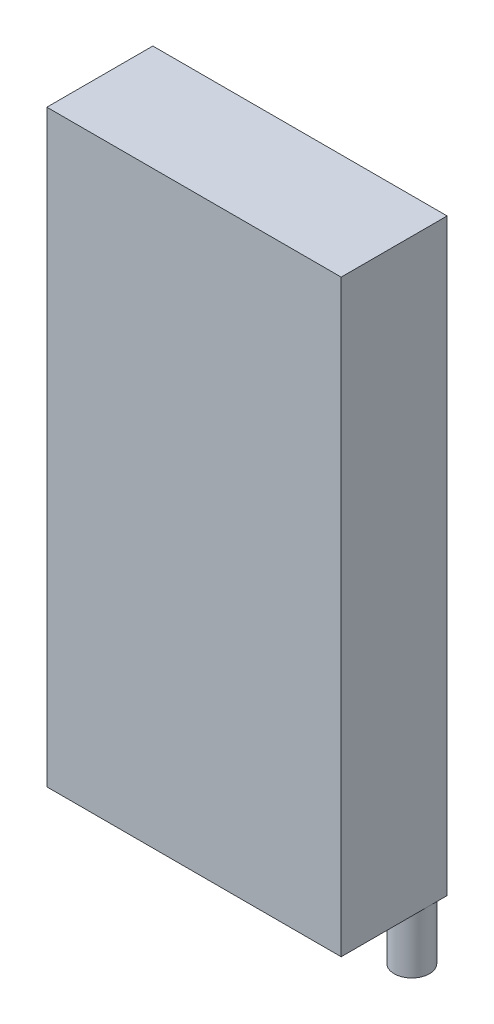
ISO-10303-21;
HEADER;
FILE_DESCRIPTION(('STEP AP214'),'2;1');
FILE_NAME('part.step','',(''),(''),'','','');
FILE_SCHEMA(('AUTOMOTIVE_DESIGN { 1 0 10303 214 1 1 1 1 }'));
ENDSEC;
DATA;
#1=APPLICATION_CONTEXT('core data for automotive mechanical design processes');
#2=APPLICATION_PROTOCOL_DEFINITION('international standard','automotive_design',2000,#1);
#3=PRODUCT_CONTEXT('',#1,'mechanical');
#4=PRODUCT('Part','Part','',(#3));
#5=PRODUCT_RELATED_PRODUCT_CATEGORY('part','',(#4));
#6=PRODUCT_DEFINITION_FORMATION('','',#4);
#7=PRODUCT_DEFINITION_CONTEXT('part definition',#1,'design');
#8=PRODUCT_DEFINITION('design','',#6,#7);
#9=PRODUCT_DEFINITION_SHAPE('','',#8);
#10=(LENGTH_UNIT() NAMED_UNIT(*) SI_UNIT(.MILLI.,.METRE.));
#11=(NAMED_UNIT(*) PLANE_ANGLE_UNIT() SI_UNIT($,.RADIAN.));
#12=(NAMED_UNIT(*) SI_UNIT($,.STERADIAN.) SOLID_ANGLE_UNIT());
#13=UNCERTAINTY_MEASURE_WITH_UNIT(LENGTH_MEASURE(1.E-05),#10,'distance_accuracy_value','');
#14=(GEOMETRIC_REPRESENTATION_CONTEXT(3) GLOBAL_UNCERTAINTY_ASSIGNED_CONTEXT((#13)) GLOBAL_UNIT_ASSIGNED_CONTEXT((#10,
#11,#12)) REPRESENTATION_CONTEXT('',''));
#15=CARTESIAN_POINT('',(0.,0.,0.));
#16=DIRECTION('',(0.,0.,1.));
#17=DIRECTION('',(1.,0.,0.));
#18=AXIS2_PLACEMENT_3D('',#15,#16,#17);
#19=CARTESIAN_POINT('',(-12.5,-25.,9.));
#20=DIRECTION('',(0.,1.,0.));
#21=DIRECTION('',(0.,0.,1.));
#22=AXIS2_PLACEMENT_3D('',#19,#20,#21);
#23=PLANE('',#22);
#24=CARTESIAN_POINT('',(-11.,-25.,1.5));
#25=DIRECTION('',(0.,-1.,0.));
#26=DIRECTION('',(0.,0.,-1.));
#27=AXIS2_PLACEMENT_3D('',#24,#25,#26);
#28=CIRCLE('',#27,1.5);
#29=CARTESIAN_POINT('',(-12.5,-25.,1.5));
#30=VERTEX_POINT('',#29);
#31=CARTESIAN_POINT('',(-11.,-25.,0.));
#32=VERTEX_POINT('',#31);
#33=EDGE_CURVE('E111',#30,#32,#28,.T.);
#34=ORIENTED_EDGE('',*,*,#33,.F.);
#35=DIRECTION('',(0.,0.,-1.));
#36=VECTOR('',#35,1.);
#37=CARTESIAN_POINT('',(-12.5,-25.,9.));
#38=LINE('',#37,#36);
#39=CARTESIAN_POINT('',(-12.5,-25.,0.));
#40=VERTEX_POINT('',#39);
#41=EDGE_CURVE('E98',#30,#40,#38,.T.);
#42=ORIENTED_EDGE('',*,*,#41,.T.);
#43=DIRECTION('',(1.,0.,0.));
#44=VECTOR('',#43,1.);
#45=CARTESIAN_POINT('',(-12.5,-25.,0.));
#46=LINE('',#45,#44);
#47=EDGE_CURVE('E112',#40,#32,#46,.T.);
#48=ORIENTED_EDGE('',*,*,#47,.T.);
#49=EDGE_LOOP('',(#34,#42,#48));
#50=FACE_BOUND('',#49,.T.);
#51=ADVANCED_FACE('F39',(#50),#23,.F.);
#52=CARTESIAN_POINT('',(11.,-25.,1.5));
#53=DIRECTION('',(0.,-1.,0.));
#54=DIRECTION('',(0.,0.,1.));
#55=AXIS2_PLACEMENT_3D('',#52,#53,#54);
#56=CIRCLE('',#55,1.5);
#57=CARTESIAN_POINT('',(11.,-25.,0.));
#58=VERTEX_POINT('',#57);
#59=CARTESIAN_POINT('',(12.5,-25.,1.5));
#60=VERTEX_POINT('',#59);
#61=EDGE_CURVE('E49',#58,#60,#56,.T.);
#62=ORIENTED_EDGE('',*,*,#61,.F.);
#63=CARTESIAN_POINT('',(12.5,-25.,0.));
#64=VERTEX_POINT('',#63);
#65=EDGE_CURVE('E139',#58,#64,#46,.T.);
#66=ORIENTED_EDGE('',*,*,#65,.T.);
#67=DIRECTION('',(0.,0.,-1.));
#68=VECTOR('',#67,1.);
#69=CARTESIAN_POINT('',(12.5,-25.,9.));
#70=LINE('',#69,#68);
#71=EDGE_CURVE('E133',#60,#64,#70,.T.);
#72=ORIENTED_EDGE('',*,*,#71,.F.);
#73=EDGE_LOOP('',(#62,#66,#72));
#74=FACE_BOUND('',#73,.T.);
#75=ADVANCED_FACE('F157',(#74),#23,.F.);
#76=CARTESIAN_POINT('',(12.5,25.,9.));
#77=DIRECTION('',(-1.,0.,0.));
#78=DIRECTION('',(0.,-1.,0.));
#79=AXIS2_PLACEMENT_3D('',#76,#77,#78);
#80=PLANE('',#79);
#81=DIRECTION('',(0.,1.,0.));
#82=VECTOR('',#81,1.);
#83=CARTESIAN_POINT('',(12.5,25.,0.));
#84=LINE('',#83,#82);
#85=CARTESIAN_POINT('',(12.5,25.,0.));
#86=VERTEX_POINT('',#85);
#87=EDGE_CURVE('E122',#64,#86,#84,.T.);
#88=ORIENTED_EDGE('',*,*,#87,.T.);
#89=DIRECTION('',(0.,0.,-1.));
#90=VECTOR('',#89,1.);
#91=CARTESIAN_POINT('',(12.5,25.,9.));
#92=LINE('',#91,#90);
#93=CARTESIAN_POINT('',(12.5,25.,9.));
#94=VERTEX_POINT('',#93);
#95=EDGE_CURVE('E43',#94,#86,#92,.T.);
#96=ORIENTED_EDGE('',*,*,#95,.F.);
#97=DIRECTION('',(0.,1.,0.));
#98=VECTOR('',#97,1.);
#99=CARTESIAN_POINT('',(12.5,25.,9.));
#100=LINE('',#99,#98);
#101=CARTESIAN_POINT('',(12.5,-25.,9.));
#102=VERTEX_POINT('',#101);
#103=EDGE_CURVE('E125',#102,#94,#100,.T.);
#104=ORIENTED_EDGE('',*,*,#103,.F.);
#105=EDGE_CURVE('E109',#102,#60,#70,.T.);
#106=ORIENTED_EDGE('',*,*,#105,.T.);
#107=ORIENTED_EDGE('',*,*,#71,.T.);
#108=EDGE_LOOP('',(#88,#96,#104,#106,#107));
#109=FACE_BOUND('',#108,.T.);
#110=ADVANCED_FACE('F41',(#109),#80,.F.);
#111=CARTESIAN_POINT('',(-12.5,25.,9.));
#112=DIRECTION('',(0.,-1.,0.));
#113=DIRECTION('',(0.,0.,-1.));
#114=AXIS2_PLACEMENT_3D('',#111,#112,#113);
#115=PLANE('',#114);
#116=DIRECTION('',(-1.,0.,0.));
#117=VECTOR('',#116,1.);
#118=CARTESIAN_POINT('',(-12.5,25.,0.));
#119=LINE('',#118,#117);
#120=CARTESIAN_POINT('',(-12.5,25.,0.));
#121=VERTEX_POINT('',#120);
#122=EDGE_CURVE('E136',#86,#121,#119,.T.);
#123=ORIENTED_EDGE('',*,*,#122,.T.);
#124=DIRECTION('',(0.,0.,-1.));
#125=VECTOR('',#124,1.);
#126=CARTESIAN_POINT('',(-12.5,25.,9.));
#127=LINE('',#126,#125);
#128=CARTESIAN_POINT('',(-12.5,25.,9.));
#129=VERTEX_POINT('',#128);
#130=EDGE_CURVE('E97',#129,#121,#127,.T.);
#131=ORIENTED_EDGE('',*,*,#130,.F.);
#132=DIRECTION('',(-1.,0.,0.));
#133=VECTOR('',#132,1.);
#134=CARTESIAN_POINT('',(-12.5,25.,9.));
#135=LINE('',#134,#133);
#136=EDGE_CURVE('E128',#94,#129,#135,.T.);
#137=ORIENTED_EDGE('',*,*,#136,.F.);
#138=ORIENTED_EDGE('',*,*,#95,.T.);
#139=EDGE_LOOP('',(#123,#131,#137,#138));
#140=FACE_BOUND('',#139,.T.);
#141=ADVANCED_FACE('F147',(#140),#115,.F.);
#142=CARTESIAN_POINT('',(-12.5,25.,9.));
#143=DIRECTION('',(1.,0.,0.));
#144=DIRECTION('',(0.,1.,0.));
#145=AXIS2_PLACEMENT_3D('',#142,#143,#144);
#146=PLANE('',#145);
#147=DIRECTION('',(0.,-1.,0.));
#148=VECTOR('',#147,1.);
#149=CARTESIAN_POINT('',(-12.5,25.,0.));
#150=LINE('',#149,#148);
#151=EDGE_CURVE('E105',#121,#40,#150,.T.);
#152=ORIENTED_EDGE('',*,*,#151,.T.);
#153=ORIENTED_EDGE('',*,*,#41,.F.);
#154=CARTESIAN_POINT('',(-12.5,-25.,9.));
#155=VERTEX_POINT('',#154);
#156=EDGE_CURVE('E91',#155,#30,#38,.T.);
#157=ORIENTED_EDGE('',*,*,#156,.F.);
#158=DIRECTION('',(0.,-1.,0.));
#159=VECTOR('',#158,1.);
#160=CARTESIAN_POINT('',(-12.5,25.,9.));
#161=LINE('',#160,#159);
#162=EDGE_CURVE('E130',#129,#155,#161,.T.);
#163=ORIENTED_EDGE('',*,*,#162,.F.);
#164=ORIENTED_EDGE('',*,*,#130,.T.);
#165=EDGE_LOOP('',(#152,#153,#157,#163,#164));
#166=FACE_BOUND('',#165,.T.);
#167=ADVANCED_FACE('F102',(#166),#146,.F.);
#168=EDGE_CURVE('E56',#32,#30,#28,.T.);
#169=ORIENTED_EDGE('',*,*,#168,.F.);
#170=EDGE_CURVE('E141',#32,#58,#46,.T.);
#171=ORIENTED_EDGE('',*,*,#170,.T.);
#172=EDGE_CURVE('E11',#60,#58,#56,.T.);
#173=ORIENTED_EDGE('',*,*,#172,.F.);
#174=ORIENTED_EDGE('',*,*,#105,.F.);
#175=DIRECTION('',(1.,0.,0.));
#176=VECTOR('',#175,1.);
#177=CARTESIAN_POINT('',(-12.5,-25.,9.));
#178=LINE('',#177,#176);
#179=EDGE_CURVE('E94',#155,#102,#178,.T.);
#180=ORIENTED_EDGE('',*,*,#179,.F.);
#181=ORIENTED_EDGE('',*,*,#156,.T.);
#182=EDGE_LOOP('',(#169,#171,#173,#174,#180,#181));
#183=FACE_BOUND('',#182,.T.);
#184=ADVANCED_FACE('F93',(#183),#23,.F.);
#185=CARTESIAN_POINT('',(0.,0.,9.));
#186=DIRECTION('',(0.,0.,1.));
#187=DIRECTION('',(1.,0.,0.));
#188=AXIS2_PLACEMENT_3D('',#185,#186,#187);
#189=PLANE('',#188);
#190=ORIENTED_EDGE('',*,*,#103,.T.);
#191=ORIENTED_EDGE('',*,*,#136,.T.);
#192=ORIENTED_EDGE('',*,*,#162,.T.);
#193=ORIENTED_EDGE('',*,*,#179,.T.);
#194=EDGE_LOOP('',(#190,#191,#192,#193));
#195=FACE_BOUND('',#194,.T.);
#196=ADVANCED_FACE('F170',(#195),#189,.T.);
#197=CARTESIAN_POINT('',(0.,0.,0.));
#198=DIRECTION('',(0.,0.,1.));
#199=DIRECTION('',(1.,0.,0.));
#200=AXIS2_PLACEMENT_3D('',#197,#198,#199);
#201=PLANE('',#200);
#202=ORIENTED_EDGE('',*,*,#87,.F.);
#203=ORIENTED_EDGE('',*,*,#65,.F.);
#204=ORIENTED_EDGE('',*,*,#170,.F.);
#205=ORIENTED_EDGE('',*,*,#47,.F.);
#206=ORIENTED_EDGE('',*,*,#151,.F.);
#207=ORIENTED_EDGE('',*,*,#122,.F.);
#208=EDGE_LOOP('',(#202,#203,#204,#205,#206,#207));
#209=FACE_BOUND('',#208,.T.);
#210=ADVANCED_FACE('F154',(#209),#201,.F.);
#211=CARTESIAN_POINT('',(11.,-30.,1.5));
#212=DIRECTION('',(0.,1.,0.));
#213=DIRECTION('',(0.,0.,1.));
#214=AXIS2_PLACEMENT_3D('',#211,#212,#213);
#215=CYLINDRICAL_SURFACE('',#214,1.5);
#216=CARTESIAN_POINT('',(11.,-30.,1.5));
#217=DIRECTION('',(0.,-1.,0.));
#218=DIRECTION('',(0.,0.,1.));
#219=AXIS2_PLACEMENT_3D('',#216,#217,#218);
#220=CIRCLE('',#219,1.5);
#221=CARTESIAN_POINT('',(11.,-30.,3.));
#222=VERTEX_POINT('',#221);
#223=EDGE_CURVE('E120',#222,#222,#220,.T.);
#224=ORIENTED_EDGE('',*,*,#223,.F.);
#225=EDGE_LOOP('',(#224));
#226=FACE_BOUND('',#225,.T.);
#227=ORIENTED_EDGE('',*,*,#61,.T.);
#228=ORIENTED_EDGE('',*,*,#172,.T.);
#229=EDGE_LOOP('',(#227,#228));
#230=FACE_BOUND('',#229,.T.);
#231=ADVANCED_FACE('F159',(#226,#230),#215,.T.);
#232=CARTESIAN_POINT('',(11.,-30.,1.5));
#233=DIRECTION('',(0.,1.,0.));
#234=DIRECTION('',(0.,0.,1.));
#235=AXIS2_PLACEMENT_3D('',#232,#233,#234);
#236=PLANE('',#235);
#237=ORIENTED_EDGE('',*,*,#223,.T.);
#238=EDGE_LOOP('',(#237));
#239=FACE_BOUND('',#238,.T.);
#240=ADVANCED_FACE('F161',(#239),#236,.F.);
#241=CARTESIAN_POINT('',(-11.,-30.,1.5));
#242=DIRECTION('',(0.,1.,0.));
#243=DIRECTION('',(0.,0.,1.));
#244=AXIS2_PLACEMENT_3D('',#241,#242,#243);
#245=CYLINDRICAL_SURFACE('',#244,1.5);
#246=CARTESIAN_POINT('',(-11.,-30.,1.5));
#247=DIRECTION('',(0.,-1.,0.));
#248=DIRECTION('',(0.,0.,-1.));
#249=AXIS2_PLACEMENT_3D('',#246,#247,#248);
#250=CIRCLE('',#249,1.5);
#251=CARTESIAN_POINT('',(-11.,-30.,0.));
#252=VERTEX_POINT('',#251);
#253=EDGE_CURVE('E116',#252,#252,#250,.T.);
#254=ORIENTED_EDGE('',*,*,#253,.F.);
#255=EDGE_LOOP('',(#254));
#256=FACE_BOUND('',#255,.T.);
#257=ORIENTED_EDGE('',*,*,#168,.T.);
#258=ORIENTED_EDGE('',*,*,#33,.T.);
#259=EDGE_LOOP('',(#257,#258));
#260=FACE_BOUND('',#259,.T.);
#261=ADVANCED_FACE('F115',(#256,#260),#245,.T.);
#262=CARTESIAN_POINT('',(-11.,-30.,1.5));
#263=DIRECTION('',(0.,-1.,0.));
#264=DIRECTION('',(0.,0.,-1.));
#265=AXIS2_PLACEMENT_3D('',#262,#263,#264);
#266=PLANE('',#265);
#267=ORIENTED_EDGE('',*,*,#253,.T.);
#268=EDGE_LOOP('',(#267));
#269=FACE_BOUND('',#268,.T.);
#270=ADVANCED_FACE('F247',(#269),#266,.T.);
#271=CLOSED_SHELL('',(#51,#75,#110,#141,#167,#184,#196,#210,#231,#240,#261,#270));
#272=MANIFOLD_SOLID_BREP('B2',#271);
#273=ADVANCED_BREP_SHAPE_REPRESENTATION('',(#18,#272),#14);
#274=SHAPE_DEFINITION_REPRESENTATION(#9,#273);
ENDSEC;
END-ISO-10303-21;
